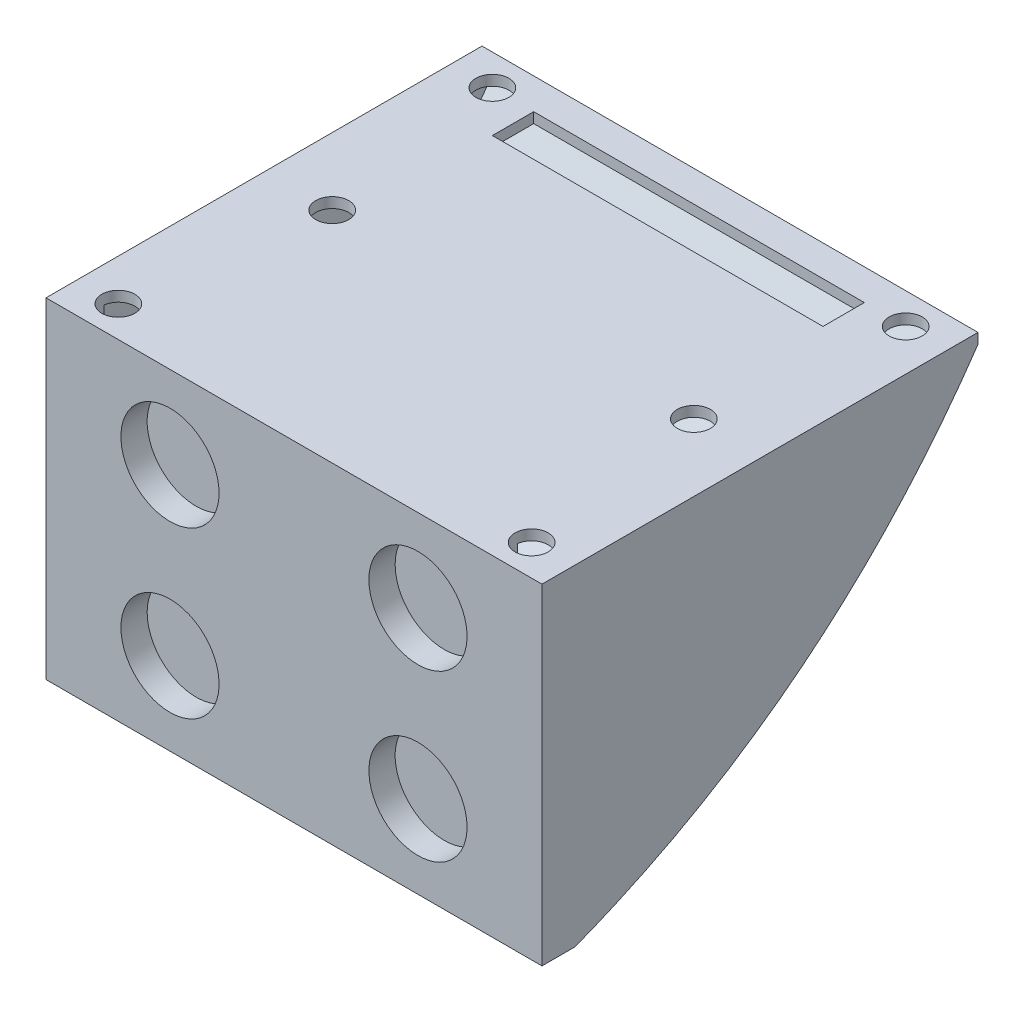
ISO-10303-21;
HEADER;
FILE_DESCRIPTION(('STEP AP214'),'2;1');
FILE_NAME('part.step','',(''),(''),'','','');
FILE_SCHEMA(('AUTOMOTIVE_DESIGN { 1 0 10303 214 1 1 1 1 }'));
ENDSEC;
DATA;
#1=APPLICATION_CONTEXT('core data for automotive mechanical design processes');
#2=APPLICATION_PROTOCOL_DEFINITION('international standard','automotive_design',2000,#1);
#3=PRODUCT_CONTEXT('',#1,'mechanical');
#4=PRODUCT('Part','Part','',(#3));
#5=PRODUCT_RELATED_PRODUCT_CATEGORY('part','',(#4));
#6=PRODUCT_DEFINITION_FORMATION('','',#4);
#7=PRODUCT_DEFINITION_CONTEXT('part definition',#1,'design');
#8=PRODUCT_DEFINITION('design','',#6,#7);
#9=PRODUCT_DEFINITION_SHAPE('','',#8);
#10=(LENGTH_UNIT() NAMED_UNIT(*) SI_UNIT(.MILLI.,.METRE.));
#11=(NAMED_UNIT(*) PLANE_ANGLE_UNIT() SI_UNIT($,.RADIAN.));
#12=(NAMED_UNIT(*) SI_UNIT($,.STERADIAN.) SOLID_ANGLE_UNIT());
#13=UNCERTAINTY_MEASURE_WITH_UNIT(LENGTH_MEASURE(1.E-05),#10,'distance_accuracy_value','');
#14=(GEOMETRIC_REPRESENTATION_CONTEXT(3) GLOBAL_UNCERTAINTY_ASSIGNED_CONTEXT((#13)) GLOBAL_UNIT_ASSIGNED_CONTEXT((#10,
#11,#12)) REPRESENTATION_CONTEXT('',''));
#15=CARTESIAN_POINT('',(0.,0.,0.));
#16=DIRECTION('',(0.,0.,1.));
#17=DIRECTION('',(1.,0.,0.));
#18=AXIS2_PLACEMENT_3D('',#15,#16,#17);
#19=CARTESIAN_POINT('',(46.,31.,0.));
#20=DIRECTION('',(0.,0.,1.));
#21=DIRECTION('',(0.,-1.,0.));
#22=AXIS2_PLACEMENT_3D('',#19,#20,#21);
#23=PLANE('',#22);
#24=DIRECTION('',(-1.,0.,0.));
#25=VECTOR('',#24,1.);
#26=CARTESIAN_POINT('',(2.,0.,0.));
#27=LINE('',#26,#25);
#28=CARTESIAN_POINT('',(42.4125492133612,0.,0.));
#29=VERTEX_POINT('',#28);
#30=CARTESIAN_POINT('',(5.58745078663875,0.,0.));
#31=VERTEX_POINT('',#30);
#32=EDGE_CURVE('E180',#29,#31,#27,.T.);
#33=ORIENTED_EDGE('',*,*,#32,.T.);
#34=DIRECTION('',(0.,1.,0.));
#35=VECTOR('',#34,1.);
#36=CARTESIAN_POINT('',(5.58745078663875,32.,0.));
#37=LINE('',#36,#35);
#38=CARTESIAN_POINT('',(5.58745078663875,31.,0.));
#39=VERTEX_POINT('',#38);
#40=EDGE_CURVE('E52',#31,#39,#37,.T.);
#41=ORIENTED_EDGE('',*,*,#40,.T.);
#42=DIRECTION('',(-1.,0.,0.));
#43=VECTOR('',#42,1.);
#44=CARTESIAN_POINT('',(46.,31.,0.));
#45=LINE('',#44,#43);
#46=CARTESIAN_POINT('',(42.4125492133612,31.,0.));
#47=VERTEX_POINT('',#46);
#48=EDGE_CURVE('E222',#47,#39,#45,.T.);
#49=ORIENTED_EDGE('',*,*,#48,.F.);
#50=DIRECTION('',(0.,1.,0.));
#51=VECTOR('',#50,1.);
#52=CARTESIAN_POINT('',(42.4125492133612,32.,0.));
#53=LINE('',#52,#51);
#54=EDGE_CURVE('E388',#47,#29,#53,.F.);
#55=ORIENTED_EDGE('',*,*,#54,.T.);
#56=EDGE_LOOP('',(#33,#41,#49,#55));
#57=FACE_BOUND('',#56,.T.);
#58=ADVANCED_FACE('F37',(#57),#23,.F.);
#59=CARTESIAN_POINT('',(46.,0.,0.));
#60=VERTEX_POINT('',#59);
#61=CARTESIAN_POINT('',(45.5874507866387,0.,0.));
#62=VERTEX_POINT('',#61);
#63=EDGE_CURVE('E182',#60,#62,#27,.T.);
#64=ORIENTED_EDGE('',*,*,#63,.T.);
#65=DIRECTION('',(0.,1.,0.));
#66=VECTOR('',#65,1.);
#67=CARTESIAN_POINT('',(45.5874507866387,32.,0.));
#68=LINE('',#67,#66);
#69=CARTESIAN_POINT('',(45.5874507866387,31.,0.));
#70=VERTEX_POINT('',#69);
#71=EDGE_CURVE('E59',#62,#70,#68,.T.);
#72=ORIENTED_EDGE('',*,*,#71,.T.);
#73=CARTESIAN_POINT('',(46.,31.,0.));
#74=VERTEX_POINT('',#73);
#75=EDGE_CURVE('E210',#74,#70,#45,.T.);
#76=ORIENTED_EDGE('',*,*,#75,.F.);
#77=DIRECTION('',(0.,1.,0.));
#78=VECTOR('',#77,1.);
#79=CARTESIAN_POINT('',(46.,31.,0.));
#80=LINE('',#79,#78);
#81=EDGE_CURVE('E471',#60,#74,#80,.T.);
#82=ORIENTED_EDGE('',*,*,#81,.F.);
#83=EDGE_LOOP('',(#64,#72,#76,#82));
#84=FACE_BOUND('',#83,.T.);
#85=ADVANCED_FACE('F267',(#84),#23,.F.);
#86=CARTESIAN_POINT('',(0.,32.,3.2));
#87=DIRECTION('',(0.,-1.,0.));
#88=DIRECTION('',(0.,0.,-1.));
#89=AXIS2_PLACEMENT_3D('',#86,#87,#88);
#90=PLANE('',#89);
#91=CARTESIAN_POINT('',(4.,32.,-36.));
#92=DIRECTION('',(0.,1.,0.));
#93=DIRECTION('',(0.,0.,1.));
#94=AXIS2_PLACEMENT_3D('',#91,#92,#93);
#95=CIRCLE('',#94,1.59999999999999);
#96=CARTESIAN_POINT('',(4.,32.,-34.4));
#97=VERTEX_POINT('',#96);
#98=EDGE_CURVE('E377',#97,#97,#95,.T.);
#99=ORIENTED_EDGE('',*,*,#98,.F.);
#100=EDGE_LOOP('',(#99));
#101=FACE_BOUND('',#100,.T.);
#102=CARTESIAN_POINT('',(4.,32.,0.199999999999999));
#103=DIRECTION('',(0.,1.,0.));
#104=DIRECTION('',(0.,0.,1.));
#105=AXIS2_PLACEMENT_3D('',#102,#103,#104);
#106=CIRCLE('',#105,1.59999999999999);
#107=CARTESIAN_POINT('',(4.,32.,1.79999999999999));
#108=VERTEX_POINT('',#107);
#109=EDGE_CURVE('E174',#108,#108,#106,.T.);
#110=ORIENTED_EDGE('',*,*,#109,.F.);
#111=EDGE_LOOP('',(#110));
#112=FACE_BOUND('',#111,.T.);
#113=CARTESIAN_POINT('',(44.,32.,0.199999999999999));
#114=DIRECTION('',(0.,1.,0.));
#115=DIRECTION('',(0.,0.,1.));
#116=AXIS2_PLACEMENT_3D('',#113,#114,#115);
#117=CIRCLE('',#116,1.59999999999999);
#118=CARTESIAN_POINT('',(44.,32.,1.79999999999999));
#119=VERTEX_POINT('',#118);
#120=EDGE_CURVE('E385',#119,#119,#117,.T.);
#121=ORIENTED_EDGE('',*,*,#120,.F.);
#122=EDGE_LOOP('',(#121));
#123=FACE_BOUND('',#122,.T.);
#124=CARTESIAN_POINT('',(6.5,32.,-18.));
#125=DIRECTION('',(0.,1.,0.));
#126=DIRECTION('',(0.,0.,1.));
#127=AXIS2_PLACEMENT_3D('',#124,#125,#126);
#128=CIRCLE('',#127,1.59999999999999);
#129=CARTESIAN_POINT('',(6.5,32.,-16.4));
#130=VERTEX_POINT('',#129);
#131=EDGE_CURVE('E556',#130,#130,#128,.T.);
#132=ORIENTED_EDGE('',*,*,#131,.F.);
#133=EDGE_LOOP('',(#132));
#134=FACE_BOUND('',#133,.T.);
#135=DIRECTION('',(0.,0.,-1.));
#136=VECTOR('',#135,1.);
#137=CARTESIAN_POINT('',(48.,32.,3.2));
#138=LINE('',#137,#136);
#139=CARTESIAN_POINT('',(48.,32.,3.2));
#140=VERTEX_POINT('',#139);
#141=CARTESIAN_POINT('',(48.,32.,-39.));
#142=VERTEX_POINT('',#141);
#143=EDGE_CURVE('E521',#140,#142,#138,.T.);
#144=ORIENTED_EDGE('',*,*,#143,.T.);
#145=DIRECTION('',(1.,0.,0.));
#146=VECTOR('',#145,1.);
#147=CARTESIAN_POINT('',(48.,32.,-39.));
#148=LINE('',#147,#146);
#149=CARTESIAN_POINT('',(0.,32.,-39.));
#150=VERTEX_POINT('',#149);
#151=EDGE_CURVE('E539',#150,#142,#148,.T.);
#152=ORIENTED_EDGE('',*,*,#151,.F.);
#153=DIRECTION('',(0.,0.,-1.));
#154=VECTOR('',#153,1.);
#155=CARTESIAN_POINT('',(0.,32.,3.2));
#156=LINE('',#155,#154);
#157=CARTESIAN_POINT('',(0.,32.,3.2));
#158=VERTEX_POINT('',#157);
#159=EDGE_CURVE('E530',#158,#150,#156,.T.);
#160=ORIENTED_EDGE('',*,*,#159,.F.);
#161=DIRECTION('',(-1.,0.,0.));
#162=VECTOR('',#161,1.);
#163=CARTESIAN_POINT('',(0.,32.,3.2));
#164=LINE('',#163,#162);
#165=EDGE_CURVE('E528',#140,#158,#164,.T.);
#166=ORIENTED_EDGE('',*,*,#165,.F.);
#167=EDGE_LOOP('',(#144,#152,#160,#166));
#168=FACE_BOUND('',#167,.T.);
#169=CARTESIAN_POINT('',(41.5,32.,-18.));
#170=DIRECTION('',(0.,1.,0.));
#171=DIRECTION('',(0.,0.,1.));
#172=AXIS2_PLACEMENT_3D('',#169,#170,#171);
#173=CIRCLE('',#172,1.59999999999999);
#174=CARTESIAN_POINT('',(41.5,32.,-16.4));
#175=VERTEX_POINT('',#174);
#176=EDGE_CURVE('E552',#175,#175,#173,.T.);
#177=ORIENTED_EDGE('',*,*,#176,.F.);
#178=EDGE_LOOP('',(#177));
#179=FACE_BOUND('',#178,.T.);
#180=DIRECTION('',(1.,0.,0.));
#181=VECTOR('',#180,1.);
#182=CARTESIAN_POINT('',(8.,32.,-32.));
#183=LINE('',#182,#181);
#184=CARTESIAN_POINT('',(8.,32.,-32.));
#185=VERTEX_POINT('',#184);
#186=CARTESIAN_POINT('',(40.,32.,-32.));
#187=VERTEX_POINT('',#186);
#188=EDGE_CURVE('E435',#185,#187,#183,.T.);
#189=ORIENTED_EDGE('',*,*,#188,.F.);
#190=DIRECTION('',(0.,0.,1.));
#191=VECTOR('',#190,1.);
#192=CARTESIAN_POINT('',(8.,32.,-32.));
#193=LINE('',#192,#191);
#194=CARTESIAN_POINT('',(8.,32.,-36.));
#195=VERTEX_POINT('',#194);
#196=EDGE_CURVE('E433',#195,#185,#193,.T.);
#197=ORIENTED_EDGE('',*,*,#196,.F.);
#198=DIRECTION('',(-1.,0.,0.));
#199=VECTOR('',#198,1.);
#200=CARTESIAN_POINT('',(8.,32.,-36.));
#201=LINE('',#200,#199);
#202=CARTESIAN_POINT('',(40.,32.,-36.));
#203=VERTEX_POINT('',#202);
#204=EDGE_CURVE('E441',#203,#195,#201,.T.);
#205=ORIENTED_EDGE('',*,*,#204,.F.);
#206=DIRECTION('',(0.,0.,-1.));
#207=VECTOR('',#206,1.);
#208=CARTESIAN_POINT('',(40.,32.,-32.));
#209=LINE('',#208,#207);
#210=EDGE_CURVE('E438',#187,#203,#209,.T.);
#211=ORIENTED_EDGE('',*,*,#210,.F.);
#212=EDGE_LOOP('',(#189,#197,#205,#211));
#213=FACE_BOUND('',#212,.T.);
#214=CARTESIAN_POINT('',(44.,32.,-36.));
#215=DIRECTION('',(0.,1.,0.));
#216=DIRECTION('',(0.,0.,1.));
#217=AXIS2_PLACEMENT_3D('',#214,#215,#216);
#218=CIRCLE('',#217,1.59999999999999);
#219=CARTESIAN_POINT('',(44.,32.,-34.4));
#220=VERTEX_POINT('',#219);
#221=EDGE_CURVE('E395',#220,#220,#218,.T.);
#222=ORIENTED_EDGE('',*,*,#221,.F.);
#223=EDGE_LOOP('',(#222));
#224=FACE_BOUND('',#223,.T.);
#225=ADVANCED_FACE('F244',(#101,#112,#123,#134,#168,#179,#213,#224),#90,.F.);
#226=CARTESIAN_POINT('',(97.8196748283246,31.,-39.));
#227=CARTESIAN_POINT('',(97.8196748283246,9.37295047396084,-24.2252467194018));
#228=CARTESIAN_POINT('',(97.8196748283246,0.,0.));
#229=B_SPLINE_CURVE_WITH_KNOTS('',2,(#226,#227,#228),.UNSPECIFIED.,.F.,.F.,(3,3),(0.,1.),.UNSPECIFIED.);
#230=DIRECTION('',(-1.,0.,0.));
#231=VECTOR('',#230,1.);
#232=SURFACE_OF_LINEAR_EXTRUSION('',#229,#231);
#233=DIRECTION('',(1.,0.,0.));
#234=VECTOR('',#233,1.);
#235=CARTESIAN_POINT('',(0.,0.,0.));
#236=LINE('',#235,#234);
#237=CARTESIAN_POINT('',(48.,0.,0.));
#238=VERTEX_POINT('',#237);
#239=EDGE_CURVE('E503',#60,#238,#236,.T.);
#240=ORIENTED_EDGE('',*,*,#239,.F.);
#241=CARTESIAN_POINT('',(46.,31.,-39.));
#242=CARTESIAN_POINT('',(46.,9.37295047396084,-24.2252467194018));
#243=CARTESIAN_POINT('',(46.,0.,0.));
#244=B_SPLINE_CURVE_WITH_KNOTS('',2,(#241,#242,#243),.UNSPECIFIED.,.F.,.F.,(3,3),(0.,1.),.UNSPECIFIED.);
#245=CARTESIAN_POINT('',(46.,6.9200316018718,-14.));
#246=VERTEX_POINT('',#245);
#247=EDGE_CURVE('E204',#60,#246,#244,.F.);
#248=ORIENTED_EDGE('',*,*,#247,.T.);
#249=DIRECTION('',(-1.,0.,0.));
#250=VECTOR('',#249,1.);
#251=CARTESIAN_POINT('',(24.,6.92003160187179,-14.));
#252=LINE('',#251,#250);
#253=CARTESIAN_POINT('',(2.,6.9200316018718,-14.));
#254=VERTEX_POINT('',#253);
#255=EDGE_CURVE('E464',#246,#254,#252,.T.);
#256=ORIENTED_EDGE('',*,*,#255,.T.);
#257=CARTESIAN_POINT('',(2.,31.,-39.));
#258=CARTESIAN_POINT('',(2.,9.37295047396084,-24.2252467194018));
#259=CARTESIAN_POINT('',(2.,0.,0.));
#260=B_SPLINE_CURVE_WITH_KNOTS('',2,(#257,#258,#259),.UNSPECIFIED.,.F.,.F.,(3,3),(0.,1.),.UNSPECIFIED.);
#261=CARTESIAN_POINT('',(2.,0.,0.));
#262=VERTEX_POINT('',#261);
#263=EDGE_CURVE('E193',#254,#262,#260,.T.);
#264=ORIENTED_EDGE('',*,*,#263,.T.);
#265=CARTESIAN_POINT('',(0.,0.,0.));
#266=VERTEX_POINT('',#265);
#267=EDGE_CURVE('E179',#266,#262,#236,.T.);
#268=ORIENTED_EDGE('',*,*,#267,.F.);
#269=CARTESIAN_POINT('',(0.,31.,-39.));
#270=CARTESIAN_POINT('',(0.,9.37295047396084,-24.2252467194018));
#271=CARTESIAN_POINT('',(0.,0.,0.));
#272=B_SPLINE_CURVE_WITH_KNOTS('',2,(#269,#270,#271),.UNSPECIFIED.,.F.,.F.,(3,3),(0.,1.),.UNSPECIFIED.);
#273=CARTESIAN_POINT('',(0.,31.,-39.));
#274=VERTEX_POINT('',#273);
#275=EDGE_CURVE('E228',#274,#266,#272,.T.);
#276=ORIENTED_EDGE('',*,*,#275,.F.);
#277=DIRECTION('',(-1.,0.,0.));
#278=VECTOR('',#277,1.);
#279=CARTESIAN_POINT('',(48.,31.,-39.));
#280=LINE('',#279,#278);
#281=CARTESIAN_POINT('',(48.,31.,-39.));
#282=VERTEX_POINT('',#281);
#283=EDGE_CURVE('E551',#282,#274,#280,.T.);
#284=ORIENTED_EDGE('',*,*,#283,.F.);
#285=CARTESIAN_POINT('',(48.,31.,-39.));
#286=CARTESIAN_POINT('',(48.,9.37295047396084,-24.2252467194018));
#287=CARTESIAN_POINT('',(48.,0.,0.));
#288=B_SPLINE_CURVE_WITH_KNOTS('',2,(#285,#286,#287),.UNSPECIFIED.,.F.,.F.,(3,3),(0.,1.),.UNSPECIFIED.);
#289=EDGE_CURVE('E549',#238,#282,#288,.F.);
#290=ORIENTED_EDGE('',*,*,#289,.F.);
#291=EDGE_LOOP('',(#240,#248,#256,#264,#268,#276,#284,#290));
#292=FACE_BOUND('',#291,.T.);
#293=ADVANCED_FACE('F240',(#292),#232,.T.);
#294=CARTESIAN_POINT('',(0.,32.,3.2));
#295=DIRECTION('',(1.,0.,0.));
#296=DIRECTION('',(0.,1.,0.));
#297=AXIS2_PLACEMENT_3D('',#294,#295,#296);
#298=PLANE('',#297);
#299=ORIENTED_EDGE('',*,*,#275,.T.);
#300=DIRECTION('',(0.,0.,-1.));
#301=VECTOR('',#300,1.);
#302=CARTESIAN_POINT('',(0.,0.,3.2));
#303=LINE('',#302,#301);
#304=CARTESIAN_POINT('',(0.,0.,3.2));
#305=VERTEX_POINT('',#304);
#306=EDGE_CURVE('E516',#305,#266,#303,.T.);
#307=ORIENTED_EDGE('',*,*,#306,.F.);
#308=DIRECTION('',(0.,-1.,0.));
#309=VECTOR('',#308,1.);
#310=CARTESIAN_POINT('',(0.,32.,3.2));
#311=LINE('',#310,#309);
#312=EDGE_CURVE('E524',#158,#305,#311,.T.);
#313=ORIENTED_EDGE('',*,*,#312,.F.);
#314=ORIENTED_EDGE('',*,*,#159,.T.);
#315=DIRECTION('',(0.,1.,0.));
#316=VECTOR('',#315,1.);
#317=CARTESIAN_POINT('',(0.,32.,-39.));
#318=LINE('',#317,#316);
#319=EDGE_CURVE('E547',#274,#150,#318,.T.);
#320=ORIENTED_EDGE('',*,*,#319,.F.);
#321=EDGE_LOOP('',(#299,#307,#313,#314,#320));
#322=FACE_BOUND('',#321,.T.);
#323=ADVANCED_FACE('F39',(#322),#298,.F.);
#324=CARTESIAN_POINT('',(0.,0.,3.2));
#325=DIRECTION('',(0.,1.,0.));
#326=DIRECTION('',(0.,0.,1.));
#327=AXIS2_PLACEMENT_3D('',#324,#325,#326);
#328=PLANE('',#327);
#329=CARTESIAN_POINT('',(2.41254921336125,0.,0.));
#330=VERTEX_POINT('',#329);
#331=EDGE_CURVE('E170',#330,#262,#27,.T.);
#332=ORIENTED_EDGE('',*,*,#331,.F.);
#333=CARTESIAN_POINT('',(4.,0.,0.199999999999999));
#334=DIRECTION('',(0.,1.,0.));
#335=DIRECTION('',(0.,0.,1.));
#336=AXIS2_PLACEMENT_3D('',#333,#334,#335);
#337=CIRCLE('',#336,1.59999999999999);
#338=EDGE_CURVE('E12',#330,#31,#337,.T.);
#339=ORIENTED_EDGE('',*,*,#338,.T.);
#340=ORIENTED_EDGE('',*,*,#32,.F.);
#341=CARTESIAN_POINT('',(44.,0.,0.199999999999999));
#342=DIRECTION('',(0.,1.,0.));
#343=DIRECTION('',(0.,0.,1.));
#344=AXIS2_PLACEMENT_3D('',#341,#342,#343);
#345=CIRCLE('',#344,1.59999999999999);
#346=EDGE_CURVE('E45',#29,#62,#345,.T.);
#347=ORIENTED_EDGE('',*,*,#346,.T.);
#348=ORIENTED_EDGE('',*,*,#63,.F.);
#349=ORIENTED_EDGE('',*,*,#239,.T.);
#350=DIRECTION('',(0.,0.,-1.));
#351=VECTOR('',#350,1.);
#352=CARTESIAN_POINT('',(48.,0.,3.2));
#353=LINE('',#352,#351);
#354=CARTESIAN_POINT('',(48.,0.,3.2));
#355=VERTEX_POINT('',#354);
#356=EDGE_CURVE('E517',#355,#238,#353,.T.);
#357=ORIENTED_EDGE('',*,*,#356,.F.);
#358=DIRECTION('',(1.,0.,0.));
#359=VECTOR('',#358,1.);
#360=CARTESIAN_POINT('',(0.,0.,3.2));
#361=LINE('',#360,#359);
#362=EDGE_CURVE('E563',#305,#355,#361,.T.);
#363=ORIENTED_EDGE('',*,*,#362,.F.);
#364=ORIENTED_EDGE('',*,*,#306,.T.);
#365=ORIENTED_EDGE('',*,*,#267,.T.);
#366=EDGE_LOOP('',(#332,#339,#340,#347,#348,#349,#357,#363,#364,#365));
#367=FACE_BOUND('',#366,.T.);
#368=ADVANCED_FACE('F177',(#367),#328,.F.);
#369=CARTESIAN_POINT('',(48.,32.,3.2));
#370=DIRECTION('',(-1.,0.,0.));
#371=DIRECTION('',(0.,-1.,0.));
#372=AXIS2_PLACEMENT_3D('',#369,#370,#371);
#373=PLANE('',#372);
#374=ORIENTED_EDGE('',*,*,#356,.T.);
#375=ORIENTED_EDGE('',*,*,#289,.T.);
#376=DIRECTION('',(0.,-1.,0.));
#377=VECTOR('',#376,1.);
#378=CARTESIAN_POINT('',(48.,32.,-39.));
#379=LINE('',#378,#377);
#380=EDGE_CURVE('E545',#142,#282,#379,.T.);
#381=ORIENTED_EDGE('',*,*,#380,.F.);
#382=ORIENTED_EDGE('',*,*,#143,.F.);
#383=DIRECTION('',(0.,1.,0.));
#384=VECTOR('',#383,1.);
#385=CARTESIAN_POINT('',(48.,32.,3.2));
#386=LINE('',#385,#384);
#387=EDGE_CURVE('E564',#355,#140,#386,.T.);
#388=ORIENTED_EDGE('',*,*,#387,.F.);
#389=EDGE_LOOP('',(#374,#375,#381,#382,#388));
#390=FACE_BOUND('',#389,.T.);
#391=ADVANCED_FACE('F263',(#390),#373,.F.);
#392=CARTESIAN_POINT('',(0.,0.,3.2));
#393=DIRECTION('',(0.,0.,1.));
#394=DIRECTION('',(1.,0.,0.));
#395=AXIS2_PLACEMENT_3D('',#392,#393,#394);
#396=PLANE('',#395);
#397=CARTESIAN_POINT('',(12.,8.00000000000001,3.2));
#398=DIRECTION('',(0.,0.,1.));
#399=DIRECTION('',(-1.,0.,0.));
#400=AXIS2_PLACEMENT_3D('',#397,#398,#399);
#401=CIRCLE('',#400,4.75);
#402=CARTESIAN_POINT('',(7.25,8.00000000000001,3.2));
#403=VERTEX_POINT('',#402);
#404=EDGE_CURVE('E401',#403,#403,#401,.T.);
#405=ORIENTED_EDGE('',*,*,#404,.F.);
#406=EDGE_LOOP('',(#405));
#407=FACE_BOUND('',#406,.T.);
#408=CARTESIAN_POINT('',(36.,8.00000000000001,3.2));
#409=DIRECTION('',(0.,0.,1.));
#410=DIRECTION('',(1.,0.,0.));
#411=AXIS2_PLACEMENT_3D('',#408,#409,#410);
#412=CIRCLE('',#411,4.75);
#413=CARTESIAN_POINT('',(40.75,8.00000000000001,3.2));
#414=VERTEX_POINT('',#413);
#415=EDGE_CURVE('E405',#414,#414,#412,.T.);
#416=ORIENTED_EDGE('',*,*,#415,.F.);
#417=EDGE_LOOP('',(#416));
#418=FACE_BOUND('',#417,.T.);
#419=CARTESIAN_POINT('',(36.,24.,3.2));
#420=DIRECTION('',(0.,0.,1.));
#421=DIRECTION('',(-1.,0.,0.));
#422=AXIS2_PLACEMENT_3D('',#419,#420,#421);
#423=CIRCLE('',#422,4.75);
#424=CARTESIAN_POINT('',(31.25,24.,3.2));
#425=VERTEX_POINT('',#424);
#426=EDGE_CURVE('E411',#425,#425,#423,.T.);
#427=ORIENTED_EDGE('',*,*,#426,.F.);
#428=EDGE_LOOP('',(#427));
#429=FACE_BOUND('',#428,.T.);
#430=CARTESIAN_POINT('',(12.,24.,3.2));
#431=DIRECTION('',(0.,0.,1.));
#432=DIRECTION('',(1.,0.,0.));
#433=AXIS2_PLACEMENT_3D('',#430,#431,#432);
#434=CIRCLE('',#433,4.75);
#435=CARTESIAN_POINT('',(16.75,24.,3.2));
#436=VERTEX_POINT('',#435);
#437=EDGE_CURVE('E417',#436,#436,#434,.T.);
#438=ORIENTED_EDGE('',*,*,#437,.F.);
#439=EDGE_LOOP('',(#438));
#440=FACE_BOUND('',#439,.T.);
#441=ORIENTED_EDGE('',*,*,#312,.T.);
#442=ORIENTED_EDGE('',*,*,#362,.T.);
#443=ORIENTED_EDGE('',*,*,#387,.T.);
#444=ORIENTED_EDGE('',*,*,#165,.T.);
#445=EDGE_LOOP('',(#441,#442,#443,#444));
#446=FACE_BOUND('',#445,.T.);
#447=ADVANCED_FACE('F259',(#407,#418,#429,#440,#446),#396,.T.);
#448=CARTESIAN_POINT('',(0.,0.,-39.));
#449=DIRECTION('',(0.,0.,-1.));
#450=DIRECTION('',(-1.,0.,0.));
#451=AXIS2_PLACEMENT_3D('',#448,#449,#450);
#452=PLANE('',#451);
#453=ORIENTED_EDGE('',*,*,#380,.T.);
#454=ORIENTED_EDGE('',*,*,#283,.T.);
#455=ORIENTED_EDGE('',*,*,#319,.T.);
#456=ORIENTED_EDGE('',*,*,#151,.T.);
#457=EDGE_LOOP('',(#453,#454,#455,#456));
#458=FACE_BOUND('',#457,.T.);
#459=ADVANCED_FACE('F255',(#458),#452,.T.);
#460=CARTESIAN_POINT('',(41.5,32.,-18.));
#461=DIRECTION('',(0.,1.,0.));
#462=DIRECTION('',(0.,0.,1.));
#463=AXIS2_PLACEMENT_3D('',#460,#461,#462);
#464=CYLINDRICAL_SURFACE('',#463,1.59999999999999);
#465=CARTESIAN_POINT('',(41.5,31.,-18.));
#466=DIRECTION('',(0.,1.,0.));
#467=DIRECTION('',(0.,0.,1.));
#468=AXIS2_PLACEMENT_3D('',#465,#466,#467);
#469=CIRCLE('',#468,1.59999999999999);
#470=CARTESIAN_POINT('',(41.5,31.,-16.4));
#471=VERTEX_POINT('',#470);
#472=EDGE_CURVE('E225',#471,#471,#469,.F.);
#473=ORIENTED_EDGE('',*,*,#472,.T.);
#474=EDGE_LOOP('',(#473));
#475=FACE_BOUND('',#474,.T.);
#476=ORIENTED_EDGE('',*,*,#176,.T.);
#477=EDGE_LOOP('',(#476));
#478=FACE_BOUND('',#477,.T.);
#479=ADVANCED_FACE('F251',(#475,#478),#464,.F.);
#480=CARTESIAN_POINT('',(6.5,32.,-18.));
#481=DIRECTION('',(0.,1.,0.));
#482=DIRECTION('',(0.,0.,1.));
#483=AXIS2_PLACEMENT_3D('',#480,#481,#482);
#484=CYLINDRICAL_SURFACE('',#483,1.59999999999999);
#485=CARTESIAN_POINT('',(6.5,31.,-18.));
#486=DIRECTION('',(0.,1.,0.));
#487=DIRECTION('',(0.,0.,1.));
#488=AXIS2_PLACEMENT_3D('',#485,#486,#487);
#489=CIRCLE('',#488,1.59999999999999);
#490=CARTESIAN_POINT('',(6.5,31.,-16.4));
#491=VERTEX_POINT('',#490);
#492=EDGE_CURVE('E209',#491,#491,#489,.F.);
#493=ORIENTED_EDGE('',*,*,#492,.T.);
#494=EDGE_LOOP('',(#493));
#495=FACE_BOUND('',#494,.T.);
#496=ORIENTED_EDGE('',*,*,#131,.T.);
#497=EDGE_LOOP('',(#496));
#498=FACE_BOUND('',#497,.T.);
#499=ADVANCED_FACE('F247',(#495,#498),#484,.F.);
#500=CARTESIAN_POINT('',(46.,31.,0.));
#501=DIRECTION('',(0.,1.,0.));
#502=DIRECTION('',(0.,0.,1.));
#503=AXIS2_PLACEMENT_3D('',#500,#501,#502);
#504=PLANE('',#503);
#505=CARTESIAN_POINT('',(4.,31.,-36.));
#506=DIRECTION('',(0.,1.,0.));
#507=DIRECTION('',(0.,0.,1.));
#508=AXIS2_PLACEMENT_3D('',#505,#506,#507);
#509=CIRCLE('',#508,1.59999999999999);
#510=CARTESIAN_POINT('',(4.,31.,-34.4));
#511=VERTEX_POINT('',#510);
#512=EDGE_CURVE('E374',#511,#511,#509,.T.);
#513=ORIENTED_EDGE('',*,*,#512,.T.);
#514=EDGE_LOOP('',(#513));
#515=FACE_BOUND('',#514,.T.);
#516=CARTESIAN_POINT('',(44.,31.,-36.));
#517=DIRECTION('',(0.,1.,0.));
#518=DIRECTION('',(0.,0.,1.));
#519=AXIS2_PLACEMENT_3D('',#516,#517,#518);
#520=CIRCLE('',#519,1.59999999999999);
#521=CARTESIAN_POINT('',(44.,31.,-34.4));
#522=VERTEX_POINT('',#521);
#523=EDGE_CURVE('E398',#522,#522,#520,.T.);
#524=ORIENTED_EDGE('',*,*,#523,.T.);
#525=EDGE_LOOP('',(#524));
#526=FACE_BOUND('',#525,.T.);
#527=DIRECTION('',(1.,0.,0.));
#528=VECTOR('',#527,1.);
#529=CARTESIAN_POINT('',(8.,31.,-36.));
#530=LINE('',#529,#528);
#531=CARTESIAN_POINT('',(8.,31.,-36.));
#532=VERTEX_POINT('',#531);
#533=CARTESIAN_POINT('',(40.,31.,-36.));
#534=VERTEX_POINT('',#533);
#535=EDGE_CURVE('E427',#532,#534,#530,.T.);
#536=ORIENTED_EDGE('',*,*,#535,.F.);
#537=DIRECTION('',(0.,0.,-1.));
#538=VECTOR('',#537,1.);
#539=CARTESIAN_POINT('',(8.,31.,-32.));
#540=LINE('',#539,#538);
#541=CARTESIAN_POINT('',(8.,31.,-32.));
#542=VERTEX_POINT('',#541);
#543=EDGE_CURVE('E430',#542,#532,#540,.T.);
#544=ORIENTED_EDGE('',*,*,#543,.F.);
#545=DIRECTION('',(-1.,0.,0.));
#546=VECTOR('',#545,1.);
#547=CARTESIAN_POINT('',(8.,31.,-32.));
#548=LINE('',#547,#546);
#549=CARTESIAN_POINT('',(40.,31.,-32.));
#550=VERTEX_POINT('',#549);
#551=EDGE_CURVE('E447',#550,#542,#548,.T.);
#552=ORIENTED_EDGE('',*,*,#551,.F.);
#553=DIRECTION('',(0.,0.,1.));
#554=VECTOR('',#553,1.);
#555=CARTESIAN_POINT('',(40.,31.,-32.));
#556=LINE('',#555,#554);
#557=EDGE_CURVE('E423',#534,#550,#556,.T.);
#558=ORIENTED_EDGE('',*,*,#557,.F.);
#559=EDGE_LOOP('',(#536,#544,#552,#558));
#560=FACE_BOUND('',#559,.T.);
#561=ORIENTED_EDGE('',*,*,#492,.F.);
#562=EDGE_LOOP('',(#561));
#563=FACE_BOUND('',#562,.T.);
#564=ORIENTED_EDGE('',*,*,#48,.T.);
#565=CARTESIAN_POINT('',(4.,31.,0.199999999999999));
#566=DIRECTION('',(0.,1.,0.));
#567=DIRECTION('',(0.,0.,1.));
#568=AXIS2_PLACEMENT_3D('',#565,#566,#567);
#569=CIRCLE('',#568,1.59999999999999);
#570=CARTESIAN_POINT('',(2.41254921336125,31.,0.));
#571=VERTEX_POINT('',#570);
#572=EDGE_CURVE('E173',#39,#571,#569,.T.);
#573=ORIENTED_EDGE('',*,*,#572,.T.);
#574=CARTESIAN_POINT('',(2.,31.,0.));
#575=VERTEX_POINT('',#574);
#576=EDGE_CURVE('E172',#571,#575,#45,.T.);
#577=ORIENTED_EDGE('',*,*,#576,.T.);
#578=DIRECTION('',(0.,0.,-1.));
#579=VECTOR('',#578,1.);
#580=CARTESIAN_POINT('',(2.,31.,-38.));
#581=LINE('',#580,#579);
#582=CARTESIAN_POINT('',(2.,31.,-38.));
#583=VERTEX_POINT('',#582);
#584=EDGE_CURVE('E181',#575,#583,#581,.T.);
#585=ORIENTED_EDGE('',*,*,#584,.T.);
#586=DIRECTION('',(-1.,0.,0.));
#587=VECTOR('',#586,1.);
#588=CARTESIAN_POINT('',(46.,31.,-38.));
#589=LINE('',#588,#587);
#590=CARTESIAN_POINT('',(46.,31.,-38.));
#591=VERTEX_POINT('',#590);
#592=EDGE_CURVE('E205',#591,#583,#589,.T.);
#593=ORIENTED_EDGE('',*,*,#592,.F.);
#594=DIRECTION('',(0.,0.,-1.));
#595=VECTOR('',#594,1.);
#596=CARTESIAN_POINT('',(46.,31.,0.));
#597=LINE('',#596,#595);
#598=EDGE_CURVE('E468',#74,#591,#597,.T.);
#599=ORIENTED_EDGE('',*,*,#598,.F.);
#600=ORIENTED_EDGE('',*,*,#75,.T.);
#601=CARTESIAN_POINT('',(44.,31.,0.199999999999999));
#602=DIRECTION('',(0.,1.,0.));
#603=DIRECTION('',(0.,0.,1.));
#604=AXIS2_PLACEMENT_3D('',#601,#602,#603);
#605=CIRCLE('',#604,1.59999999999999);
#606=EDGE_CURVE('E391',#70,#47,#605,.T.);
#607=ORIENTED_EDGE('',*,*,#606,.T.);
#608=EDGE_LOOP('',(#564,#573,#577,#585,#593,#599,#600,#607));
#609=FACE_BOUND('',#608,.T.);
#610=ORIENTED_EDGE('',*,*,#472,.F.);
#611=EDGE_LOOP('',(#610));
#612=FACE_BOUND('',#611,.T.);
#613=ADVANCED_FACE('F250',(#515,#526,#560,#563,#609,#612),#504,.F.);
#614=ORIENTED_EDGE('',*,*,#576,.F.);
#615=DIRECTION('',(0.,1.,0.));
#616=VECTOR('',#615,1.);
#617=CARTESIAN_POINT('',(2.41254921336125,32.,0.));
#618=LINE('',#617,#616);
#619=EDGE_CURVE('E160',#571,#330,#618,.F.);
#620=ORIENTED_EDGE('',*,*,#619,.T.);
#621=ORIENTED_EDGE('',*,*,#331,.T.);
#622=DIRECTION('',(0.,-1.,0.));
#623=VECTOR('',#622,1.);
#624=CARTESIAN_POINT('',(2.,32.001,0.));
#625=LINE('',#624,#623);
#626=EDGE_CURVE('E466',#575,#262,#625,.T.);
#627=ORIENTED_EDGE('',*,*,#626,.F.);
#628=EDGE_LOOP('',(#614,#620,#621,#627));
#629=FACE_BOUND('',#628,.T.);
#630=ADVANCED_FACE('F168',(#629),#23,.F.);
#631=CARTESIAN_POINT('',(46.,31.,-38.));
#632=CARTESIAN_POINT('',(46.,11.3022506247457,-22.6678918753997));
#633=CARTESIAN_POINT('',(46.,1.,0.));
#634=B_SPLINE_CURVE_WITH_KNOTS('',2,(#631,#632,#633),.UNSPECIFIED.,.F.,.F.,(3,3),(0.,1.),.UNSPECIFIED.);
#635=DIRECTION('',(-1.,0.,0.));
#636=VECTOR('',#635,1.);
#637=SURFACE_OF_LINEAR_EXTRUSION('',#634,#636);
#638=ORIENTED_EDGE('',*,*,#592,.T.);
#639=CARTESIAN_POINT('',(2.,31.,-38.));
#640=CARTESIAN_POINT('',(2.,11.3022506247905,-22.6678918753666));
#641=CARTESIAN_POINT('',(2.,1.,0.));
#642=B_SPLINE_CURVE_WITH_KNOTS('',2,(#639,#640,#641),.UNSPECIFIED.,.F.,.F.,(3,3),(0.,1.),.UNSPECIFIED.);
#643=CARTESIAN_POINT('',(2.,8.71568379284086,-14.0000000059222));
#644=VERTEX_POINT('',#643);
#645=EDGE_CURVE('E185',#583,#644,#642,.T.);
#646=ORIENTED_EDGE('',*,*,#645,.T.);
#647=DIRECTION('',(-1.,0.,0.));
#648=VECTOR('',#647,1.);
#649=CARTESIAN_POINT('',(46.,8.71568378890793,-14.));
#650=LINE('',#649,#648);
#651=CARTESIAN_POINT('',(46.,8.71568379281159,-14.));
#652=VERTEX_POINT('',#651);
#653=EDGE_CURVE('E477',#652,#644,#650,.T.);
#654=ORIENTED_EDGE('',*,*,#653,.F.);
#655=EDGE_CURVE('E470',#591,#652,#634,.T.);
#656=ORIENTED_EDGE('',*,*,#655,.F.);
#657=EDGE_LOOP('',(#638,#646,#654,#656));
#658=FACE_BOUND('',#657,.T.);
#659=ADVANCED_FACE('F283',(#658),#637,.F.);
#660=CARTESIAN_POINT('',(46.,13.6511253123728,-20.8339459376998));
#661=DIRECTION('',(1.,0.,0.));
#662=DIRECTION('',(0.,1.,0.));
#663=AXIS2_PLACEMENT_3D('',#660,#661,#662);
#664=PLANE('',#663);
#665=ORIENTED_EDGE('',*,*,#81,.T.);
#666=ORIENTED_EDGE('',*,*,#598,.T.);
#667=ORIENTED_EDGE('',*,*,#655,.T.);
#668=DIRECTION('',(0.,-1.,0.));
#669=VECTOR('',#668,1.);
#670=CARTESIAN_POINT('',(46.,32.001,-14.));
#671=LINE('',#670,#669);
#672=EDGE_CURVE('E467',#652,#246,#671,.T.);
#673=ORIENTED_EDGE('',*,*,#672,.T.);
#674=ORIENTED_EDGE('',*,*,#247,.F.);
#675=EDGE_LOOP('',(#665,#666,#667,#673,#674));
#676=FACE_BOUND('',#675,.T.);
#677=ADVANCED_FACE('F288',(#676),#664,.F.);
#678=CARTESIAN_POINT('',(2.,32.001,-14.));
#679=DIRECTION('',(0.,0.,-1.));
#680=DIRECTION('',(-1.,0.,0.));
#681=AXIS2_PLACEMENT_3D('',#678,#679,#680);
#682=PLANE('',#681);
#683=ORIENTED_EDGE('',*,*,#672,.F.);
#684=ORIENTED_EDGE('',*,*,#653,.T.);
#685=DIRECTION('',(0.,-1.,0.));
#686=VECTOR('',#685,1.);
#687=CARTESIAN_POINT('',(2.,32.001,-14.));
#688=LINE('',#687,#686);
#689=EDGE_CURVE('E202',#644,#254,#688,.T.);
#690=ORIENTED_EDGE('',*,*,#689,.T.);
#691=ORIENTED_EDGE('',*,*,#255,.F.);
#692=EDGE_LOOP('',(#683,#684,#690,#691));
#693=FACE_BOUND('',#692,.T.);
#694=ADVANCED_FACE('F299',(#693),#682,.F.);
#695=CARTESIAN_POINT('',(2.,32.001,0.));
#696=DIRECTION('',(-1.,0.,0.));
#697=DIRECTION('',(0.,0.,1.));
#698=AXIS2_PLACEMENT_3D('',#695,#696,#697);
#699=PLANE('',#698);
#700=ORIENTED_EDGE('',*,*,#689,.F.);
#701=ORIENTED_EDGE('',*,*,#645,.F.);
#702=ORIENTED_EDGE('',*,*,#584,.F.);
#703=ORIENTED_EDGE('',*,*,#626,.T.);
#704=ORIENTED_EDGE('',*,*,#263,.F.);
#705=EDGE_LOOP('',(#700,#701,#702,#703,#704));
#706=FACE_BOUND('',#705,.T.);
#707=ADVANCED_FACE('F303',(#706),#699,.F.);
#708=CARTESIAN_POINT('',(8.,-0.00105000000000244,-32.));
#709=DIRECTION('',(-1.,0.,0.));
#710=DIRECTION('',(0.,0.,1.));
#711=AXIS2_PLACEMENT_3D('',#708,#709,#710);
#712=PLANE('',#711);
#713=ORIENTED_EDGE('',*,*,#543,.T.);
#714=DIRECTION('',(0.,1.,0.));
#715=VECTOR('',#714,1.);
#716=CARTESIAN_POINT('',(8.,-0.00105000000000244,-36.));
#717=LINE('',#716,#715);
#718=EDGE_CURVE('E445',#532,#195,#717,.T.);
#719=ORIENTED_EDGE('',*,*,#718,.T.);
#720=ORIENTED_EDGE('',*,*,#196,.T.);
#721=DIRECTION('',(0.,1.,0.));
#722=VECTOR('',#721,1.);
#723=CARTESIAN_POINT('',(8.,-0.00105000000000244,-32.));
#724=LINE('',#723,#722);
#725=EDGE_CURVE('E444',#542,#185,#724,.T.);
#726=ORIENTED_EDGE('',*,*,#725,.F.);
#727=EDGE_LOOP('',(#713,#719,#720,#726));
#728=FACE_BOUND('',#727,.T.);
#729=ADVANCED_FACE('F307',(#728),#712,.F.);
#730=CARTESIAN_POINT('',(8.,-0.00105000000000244,-36.));
#731=DIRECTION('',(0.,0.,-1.));
#732=DIRECTION('',(-1.,0.,0.));
#733=AXIS2_PLACEMENT_3D('',#730,#731,#732);
#734=PLANE('',#733);
#735=ORIENTED_EDGE('',*,*,#535,.T.);
#736=DIRECTION('',(0.,1.,0.));
#737=VECTOR('',#736,1.);
#738=CARTESIAN_POINT('',(40.,-0.00105000000000244,-36.));
#739=LINE('',#738,#737);
#740=EDGE_CURVE('E448',#534,#203,#739,.T.);
#741=ORIENTED_EDGE('',*,*,#740,.T.);
#742=ORIENTED_EDGE('',*,*,#204,.T.);
#743=ORIENTED_EDGE('',*,*,#718,.F.);
#744=EDGE_LOOP('',(#735,#741,#742,#743));
#745=FACE_BOUND('',#744,.T.);
#746=ADVANCED_FACE('F311',(#745),#734,.F.);
#747=CARTESIAN_POINT('',(40.,-0.00105000000000244,-32.));
#748=DIRECTION('',(1.,0.,0.));
#749=DIRECTION('',(0.,0.,-1.));
#750=AXIS2_PLACEMENT_3D('',#747,#748,#749);
#751=PLANE('',#750);
#752=ORIENTED_EDGE('',*,*,#557,.T.);
#753=DIRECTION('',(0.,1.,0.));
#754=VECTOR('',#753,1.);
#755=CARTESIAN_POINT('',(40.,-0.00105000000000244,-32.));
#756=LINE('',#755,#754);
#757=EDGE_CURVE('E450',#550,#187,#756,.T.);
#758=ORIENTED_EDGE('',*,*,#757,.T.);
#759=ORIENTED_EDGE('',*,*,#210,.T.);
#760=ORIENTED_EDGE('',*,*,#740,.F.);
#761=EDGE_LOOP('',(#752,#758,#759,#760));
#762=FACE_BOUND('',#761,.T.);
#763=ADVANCED_FACE('F317',(#762),#751,.F.);
#764=CARTESIAN_POINT('',(8.,-0.00105000000000244,-32.));
#765=DIRECTION('',(0.,0.,1.));
#766=DIRECTION('',(1.,0.,0.));
#767=AXIS2_PLACEMENT_3D('',#764,#765,#766);
#768=PLANE('',#767);
#769=ORIENTED_EDGE('',*,*,#551,.T.);
#770=ORIENTED_EDGE('',*,*,#725,.T.);
#771=ORIENTED_EDGE('',*,*,#188,.T.);
#772=ORIENTED_EDGE('',*,*,#757,.F.);
#773=EDGE_LOOP('',(#769,#770,#771,#772));
#774=FACE_BOUND('',#773,.T.);
#775=ADVANCED_FACE('F313',(#774),#768,.F.);
#776=CARTESIAN_POINT('',(12.,24.,0.66));
#777=DIRECTION('',(0.,0.,1.));
#778=DIRECTION('',(1.,0.,0.));
#779=AXIS2_PLACEMENT_3D('',#776,#777,#778);
#780=CYLINDRICAL_SURFACE('',#779,4.75);
#781=CARTESIAN_POINT('',(12.,24.,0.66));
#782=DIRECTION('',(0.,0.,1.));
#783=DIRECTION('',(1.,0.,0.));
#784=AXIS2_PLACEMENT_3D('',#781,#782,#783);
#785=CIRCLE('',#784,4.75);
#786=CARTESIAN_POINT('',(16.75,24.,0.66));
#787=VERTEX_POINT('',#786);
#788=EDGE_CURVE('E420',#787,#787,#785,.T.);
#789=ORIENTED_EDGE('',*,*,#788,.F.);
#790=EDGE_LOOP('',(#789));
#791=FACE_BOUND('',#790,.T.);
#792=ORIENTED_EDGE('',*,*,#437,.T.);
#793=EDGE_LOOP('',(#792));
#794=FACE_BOUND('',#793,.T.);
#795=ADVANCED_FACE('F316',(#791,#794),#780,.F.);
#796=CARTESIAN_POINT('',(12.,24.,0.66));
#797=DIRECTION('',(0.,0.,1.));
#798=DIRECTION('',(1.,0.,0.));
#799=AXIS2_PLACEMENT_3D('',#796,#797,#798);
#800=PLANE('',#799);
#801=ORIENTED_EDGE('',*,*,#788,.T.);
#802=EDGE_LOOP('',(#801));
#803=FACE_BOUND('',#802,.T.);
#804=ADVANCED_FACE('F327',(#803),#800,.T.);
#805=CARTESIAN_POINT('',(36.,24.,0.66));
#806=DIRECTION('',(0.,0.,1.));
#807=DIRECTION('',(1.,0.,0.));
#808=AXIS2_PLACEMENT_3D('',#805,#806,#807);
#809=CYLINDRICAL_SURFACE('',#808,4.75);
#810=CARTESIAN_POINT('',(36.,24.,0.66));
#811=DIRECTION('',(0.,0.,1.));
#812=DIRECTION('',(-1.,0.,0.));
#813=AXIS2_PLACEMENT_3D('',#810,#811,#812);
#814=CIRCLE('',#813,4.75);
#815=CARTESIAN_POINT('',(31.25,24.,0.66));
#816=VERTEX_POINT('',#815);
#817=EDGE_CURVE('E414',#816,#816,#814,.T.);
#818=ORIENTED_EDGE('',*,*,#817,.F.);
#819=EDGE_LOOP('',(#818));
#820=FACE_BOUND('',#819,.T.);
#821=ORIENTED_EDGE('',*,*,#426,.T.);
#822=EDGE_LOOP('',(#821));
#823=FACE_BOUND('',#822,.T.);
#824=ADVANCED_FACE('F331',(#820,#823),#809,.F.);
#825=CARTESIAN_POINT('',(36.,24.,0.66));
#826=DIRECTION('',(0.,0.,-1.));
#827=DIRECTION('',(-1.,0.,0.));
#828=AXIS2_PLACEMENT_3D('',#825,#826,#827);
#829=PLANE('',#828);
#830=ORIENTED_EDGE('',*,*,#817,.T.);
#831=EDGE_LOOP('',(#830));
#832=FACE_BOUND('',#831,.T.);
#833=ADVANCED_FACE('F335',(#832),#829,.F.);
#834=CARTESIAN_POINT('',(36.,8.00000000000001,0.66));
#835=DIRECTION('',(0.,0.,1.));
#836=DIRECTION('',(1.,0.,0.));
#837=AXIS2_PLACEMENT_3D('',#834,#835,#836);
#838=CYLINDRICAL_SURFACE('',#837,4.75);
#839=CARTESIAN_POINT('',(36.,8.00000000000001,0.66));
#840=DIRECTION('',(0.,0.,1.));
#841=DIRECTION('',(1.,0.,0.));
#842=AXIS2_PLACEMENT_3D('',#839,#840,#841);
#843=CIRCLE('',#842,4.75);
#844=CARTESIAN_POINT('',(40.75,8.00000000000001,0.66));
#845=VERTEX_POINT('',#844);
#846=EDGE_CURVE('E408',#845,#845,#843,.T.);
#847=ORIENTED_EDGE('',*,*,#846,.F.);
#848=EDGE_LOOP('',(#847));
#849=FACE_BOUND('',#848,.T.);
#850=ORIENTED_EDGE('',*,*,#415,.T.);
#851=EDGE_LOOP('',(#850));
#852=FACE_BOUND('',#851,.T.);
#853=ADVANCED_FACE('F339',(#849,#852),#838,.F.);
#854=CARTESIAN_POINT('',(36.,8.00000000000001,0.66));
#855=DIRECTION('',(0.,0.,1.));
#856=DIRECTION('',(1.,0.,0.));
#857=AXIS2_PLACEMENT_3D('',#854,#855,#856);
#858=PLANE('',#857);
#859=ORIENTED_EDGE('',*,*,#846,.T.);
#860=EDGE_LOOP('',(#859));
#861=FACE_BOUND('',#860,.T.);
#862=ADVANCED_FACE('F343',(#861),#858,.T.);
#863=CARTESIAN_POINT('',(12.,8.00000000000001,0.66));
#864=DIRECTION('',(0.,0.,1.));
#865=DIRECTION('',(1.,0.,0.));
#866=AXIS2_PLACEMENT_3D('',#863,#864,#865);
#867=CYLINDRICAL_SURFACE('',#866,4.75);
#868=CARTESIAN_POINT('',(12.,8.00000000000001,0.66));
#869=DIRECTION('',(0.,0.,1.));
#870=DIRECTION('',(-1.,0.,0.));
#871=AXIS2_PLACEMENT_3D('',#868,#869,#870);
#872=CIRCLE('',#871,4.75);
#873=CARTESIAN_POINT('',(7.25,8.00000000000001,0.66));
#874=VERTEX_POINT('',#873);
#875=EDGE_CURVE('E402',#874,#874,#872,.T.);
#876=ORIENTED_EDGE('',*,*,#875,.F.);
#877=EDGE_LOOP('',(#876));
#878=FACE_BOUND('',#877,.T.);
#879=ORIENTED_EDGE('',*,*,#404,.T.);
#880=EDGE_LOOP('',(#879));
#881=FACE_BOUND('',#880,.T.);
#882=ADVANCED_FACE('F347',(#878,#881),#867,.F.);
#883=CARTESIAN_POINT('',(12.,8.00000000000001,0.66));
#884=DIRECTION('',(0.,0.,-1.));
#885=DIRECTION('',(-1.,0.,0.));
#886=AXIS2_PLACEMENT_3D('',#883,#884,#885);
#887=PLANE('',#886);
#888=ORIENTED_EDGE('',*,*,#875,.T.);
#889=EDGE_LOOP('',(#888));
#890=FACE_BOUND('',#889,.T.);
#891=ADVANCED_FACE('F351',(#890),#887,.F.);
#892=CARTESIAN_POINT('',(44.,32.,-36.));
#893=DIRECTION('',(0.,1.,0.));
#894=DIRECTION('',(0.,0.,1.));
#895=AXIS2_PLACEMENT_3D('',#892,#893,#894);
#896=CYLINDRICAL_SURFACE('',#895,1.59999999999999);
#897=ORIENTED_EDGE('',*,*,#523,.F.);
#898=EDGE_LOOP('',(#897));
#899=FACE_BOUND('',#898,.T.);
#900=ORIENTED_EDGE('',*,*,#221,.T.);
#901=EDGE_LOOP('',(#900));
#902=FACE_BOUND('',#901,.T.);
#903=ADVANCED_FACE('F355',(#899,#902),#896,.F.);
#904=CARTESIAN_POINT('',(44.,32.,0.199999999999999));
#905=DIRECTION('',(0.,1.,0.));
#906=DIRECTION('',(0.,0.,1.));
#907=AXIS2_PLACEMENT_3D('',#904,#905,#906);
#908=CYLINDRICAL_SURFACE('',#907,1.59999999999999);
#909=ORIENTED_EDGE('',*,*,#120,.T.);
#910=EDGE_LOOP('',(#909));
#911=FACE_BOUND('',#910,.T.);
#912=ORIENTED_EDGE('',*,*,#346,.F.);
#913=ORIENTED_EDGE('',*,*,#54,.F.);
#914=ORIENTED_EDGE('',*,*,#606,.F.);
#915=ORIENTED_EDGE('',*,*,#71,.F.);
#916=EDGE_LOOP('',(#912,#913,#914,#915));
#917=FACE_BOUND('',#916,.T.);
#918=ADVANCED_FACE('F359',(#911,#917),#908,.F.);
#919=CARTESIAN_POINT('',(4.,32.,0.199999999999999));
#920=DIRECTION('',(0.,1.,0.));
#921=DIRECTION('',(0.,0.,1.));
#922=AXIS2_PLACEMENT_3D('',#919,#920,#921);
#923=CYLINDRICAL_SURFACE('',#922,1.59999999999999);
#924=ORIENTED_EDGE('',*,*,#109,.T.);
#925=EDGE_LOOP('',(#924));
#926=FACE_BOUND('',#925,.T.);
#927=ORIENTED_EDGE('',*,*,#338,.F.);
#928=ORIENTED_EDGE('',*,*,#619,.F.);
#929=ORIENTED_EDGE('',*,*,#572,.F.);
#930=ORIENTED_EDGE('',*,*,#40,.F.);
#931=EDGE_LOOP('',(#927,#928,#929,#930));
#932=FACE_BOUND('',#931,.T.);
#933=ADVANCED_FACE('F159',(#926,#932),#923,.F.);
#934=CARTESIAN_POINT('',(4.,32.,-36.));
#935=DIRECTION('',(0.,1.,0.));
#936=DIRECTION('',(0.,0.,1.));
#937=AXIS2_PLACEMENT_3D('',#934,#935,#936);
#938=CYLINDRICAL_SURFACE('',#937,1.59999999999999);
#939=ORIENTED_EDGE('',*,*,#512,.F.);
#940=EDGE_LOOP('',(#939));
#941=FACE_BOUND('',#940,.T.);
#942=ORIENTED_EDGE('',*,*,#98,.T.);
#943=EDGE_LOOP('',(#942));
#944=FACE_BOUND('',#943,.T.);
#945=ADVANCED_FACE('F366',(#941,#944),#938,.F.);
#946=CLOSED_SHELL('',(#58,#85,#225,#293,#323,#368,#391,#447,#459,#479,#499,#613,#630,#659,#677,
#694,#707,#729,#746,#763,#775,#795,#804,#824,#833,#853,#862,#882,#891,#903,#918,#933,#945));
#947=MANIFOLD_SOLID_BREP('B2',#946);
#948=ADVANCED_BREP_SHAPE_REPRESENTATION('',(#18,#947),#14);
#949=SHAPE_DEFINITION_REPRESENTATION(#9,#948);
ENDSEC;
END-ISO-10303-21;
